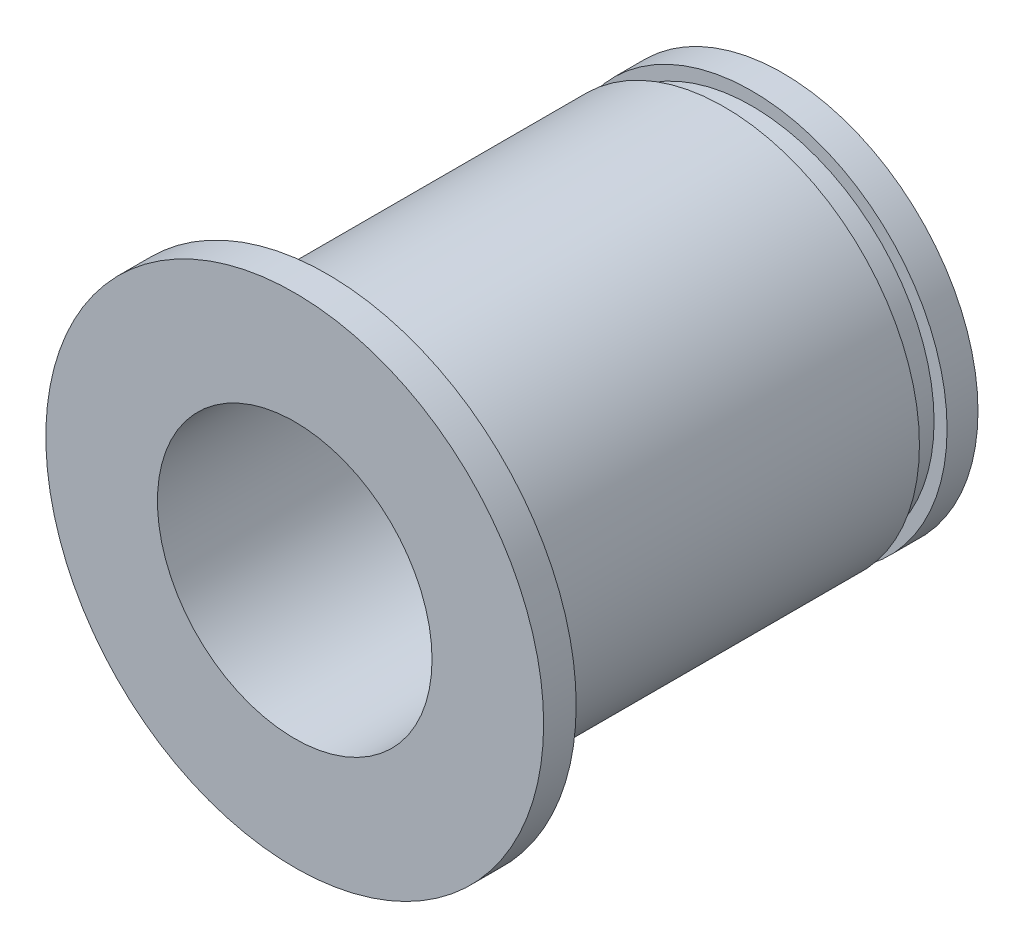
ISO-10303-21;
HEADER;
FILE_DESCRIPTION(('STEP AP214'),'2;1');
FILE_NAME('part.step','',(''),(''),'','','');
FILE_SCHEMA(('AUTOMOTIVE_DESIGN { 1 0 10303 214 1 1 1 1 }'));
ENDSEC;
DATA;
#1=APPLICATION_CONTEXT('core data for automotive mechanical design processes');
#2=APPLICATION_PROTOCOL_DEFINITION('international standard','automotive_design',2000,#1);
#3=PRODUCT_CONTEXT('',#1,'mechanical');
#4=PRODUCT('Part','Part','',(#3));
#5=PRODUCT_RELATED_PRODUCT_CATEGORY('part','',(#4));
#6=PRODUCT_DEFINITION_FORMATION('','',#4);
#7=PRODUCT_DEFINITION_CONTEXT('part definition',#1,'design');
#8=PRODUCT_DEFINITION('design','',#6,#7);
#9=PRODUCT_DEFINITION_SHAPE('','',#8);
#10=(LENGTH_UNIT() NAMED_UNIT(*) SI_UNIT(.MILLI.,.METRE.));
#11=(NAMED_UNIT(*) PLANE_ANGLE_UNIT() SI_UNIT($,.RADIAN.));
#12=(NAMED_UNIT(*) SI_UNIT($,.STERADIAN.) SOLID_ANGLE_UNIT());
#13=UNCERTAINTY_MEASURE_WITH_UNIT(LENGTH_MEASURE(1.E-05),#10,'distance_accuracy_value','');
#14=(GEOMETRIC_REPRESENTATION_CONTEXT(3) GLOBAL_UNCERTAINTY_ASSIGNED_CONTEXT((#13)) GLOBAL_UNIT_ASSIGNED_CONTEXT((#10,
#11,#12)) REPRESENTATION_CONTEXT('',''));
#15=CARTESIAN_POINT('',(0.,0.,0.));
#16=DIRECTION('',(0.,0.,1.));
#17=DIRECTION('',(1.,0.,0.));
#18=AXIS2_PLACEMENT_3D('',#15,#16,#17);
#19=CARTESIAN_POINT('',(0.,0.,12.));
#20=DIRECTION('',(0.,0.,-1.));
#21=DIRECTION('',(-1.,0.,0.));
#22=AXIS2_PLACEMENT_3D('',#19,#20,#21);
#23=CYLINDRICAL_SURFACE('',#22,6.);
#24=CARTESIAN_POINT('',(0.,0.,-2.));
#25=DIRECTION('',(0.,0.,1.));
#26=DIRECTION('',(1.,0.,0.));
#27=AXIS2_PLACEMENT_3D('',#24,#25,#26);
#28=CIRCLE('',#27,6.);
#29=CARTESIAN_POINT('',(6.,0.,-2.));
#30=VERTEX_POINT('',#29);
#31=EDGE_CURVE('E44',#30,#30,#28,.T.);
#32=ORIENTED_EDGE('',*,*,#31,.T.);
#33=EDGE_LOOP('',(#32));
#34=FACE_BOUND('',#33,.T.);
#35=CARTESIAN_POINT('',(0.,0.,-1.05));
#36=DIRECTION('',(0.,0.,1.));
#37=DIRECTION('',(1.,0.,0.));
#38=AXIS2_PLACEMENT_3D('',#35,#36,#37);
#39=CIRCLE('',#38,6.);
#40=CARTESIAN_POINT('',(6.,0.,-1.05));
#41=VERTEX_POINT('',#40);
#42=EDGE_CURVE('E53',#41,#41,#39,.T.);
#43=ORIENTED_EDGE('',*,*,#42,.F.);
#44=EDGE_LOOP('',(#43));
#45=FACE_BOUND('',#44,.T.);
#46=ADVANCED_FACE('F40',(#34,#45),#23,.T.);
#47=CARTESIAN_POINT('',(0.,0.,-2.));
#48=DIRECTION('',(0.,0.,1.));
#49=DIRECTION('',(1.,0.,0.));
#50=AXIS2_PLACEMENT_3D('',#47,#48,#49);
#51=PLANE('',#50);
#52=ORIENTED_EDGE('',*,*,#31,.F.);
#53=EDGE_LOOP('',(#52));
#54=FACE_BOUND('',#53,.T.);
#55=CARTESIAN_POINT('',(0.,0.,-2.));
#56=DIRECTION('',(0.,0.,1.));
#57=DIRECTION('',(1.,0.,0.));
#58=AXIS2_PLACEMENT_3D('',#55,#56,#57);
#59=CIRCLE('',#58,4.22);
#60=CARTESIAN_POINT('',(4.22,0.,-2.));
#61=VERTEX_POINT('',#60);
#62=EDGE_CURVE('E49',#61,#61,#59,.T.);
#63=ORIENTED_EDGE('',*,*,#62,.T.);
#64=EDGE_LOOP('',(#63));
#65=FACE_BOUND('',#64,.T.);
#66=ADVANCED_FACE('F94',(#54,#65),#51,.F.);
#67=CARTESIAN_POINT('',(0.,0.,-0.200000000000001));
#68=DIRECTION('',(0.,0.,1.));
#69=DIRECTION('',(1.,0.,0.));
#70=AXIS2_PLACEMENT_3D('',#67,#68,#69);
#71=CIRCLE('',#70,6.);
#72=CARTESIAN_POINT('',(6.,0.,-0.200000000000001));
#73=VERTEX_POINT('',#72);
#74=EDGE_CURVE('E41',#73,#73,#71,.T.);
#75=ORIENTED_EDGE('',*,*,#74,.T.);
#76=EDGE_LOOP('',(#75));
#77=FACE_BOUND('',#76,.T.);
#78=CARTESIAN_POINT('',(0.,0.,12.));
#79=DIRECTION('',(0.,0.,1.));
#80=DIRECTION('',(1.,0.,0.));
#81=AXIS2_PLACEMENT_3D('',#78,#79,#80);
#82=CIRCLE('',#81,6.);
#83=CARTESIAN_POINT('',(6.,0.,12.));
#84=VERTEX_POINT('',#83);
#85=EDGE_CURVE('E10',#84,#84,#82,.T.);
#86=ORIENTED_EDGE('',*,*,#85,.F.);
#87=EDGE_LOOP('',(#86));
#88=FACE_BOUND('',#87,.T.);
#89=ADVANCED_FACE('F39',(#77,#88),#23,.T.);
#90=CARTESIAN_POINT('',(0.,0.,12.));
#91=DIRECTION('',(0.,0.,-1.));
#92=DIRECTION('',(-1.,0.,0.));
#93=AXIS2_PLACEMENT_3D('',#90,#91,#92);
#94=CYLINDRICAL_SURFACE('',#93,4.22);
#95=ORIENTED_EDGE('',*,*,#62,.F.);
#96=EDGE_LOOP('',(#95));
#97=FACE_BOUND('',#96,.T.);
#98=CARTESIAN_POINT('',(0.,0.,13.));
#99=DIRECTION('',(0.,0.,1.));
#100=DIRECTION('',(1.,0.,0.));
#101=AXIS2_PLACEMENT_3D('',#98,#99,#100);
#102=CIRCLE('',#101,4.22);
#103=CARTESIAN_POINT('',(4.22,0.,13.));
#104=VERTEX_POINT('',#103);
#105=EDGE_CURVE('E58',#104,#104,#102,.T.);
#106=ORIENTED_EDGE('',*,*,#105,.T.);
#107=EDGE_LOOP('',(#106));
#108=FACE_BOUND('',#107,.T.);
#109=ADVANCED_FACE('F89',(#97,#108),#94,.F.);
#110=CARTESIAN_POINT('',(0.,0.,13.));
#111=DIRECTION('',(0.,0.,1.));
#112=DIRECTION('',(1.,0.,0.));
#113=AXIS2_PLACEMENT_3D('',#110,#111,#112);
#114=PLANE('',#113);
#115=CARTESIAN_POINT('',(0.,0.,13.));
#116=DIRECTION('',(0.,0.,1.));
#117=DIRECTION('',(1.,0.,0.));
#118=AXIS2_PLACEMENT_3D('',#115,#116,#117);
#119=CIRCLE('',#118,7.65);
#120=CARTESIAN_POINT('',(7.65,0.,13.));
#121=VERTEX_POINT('',#120);
#122=EDGE_CURVE('E75',#121,#121,#119,.T.);
#123=ORIENTED_EDGE('',*,*,#122,.T.);
#124=EDGE_LOOP('',(#123));
#125=FACE_BOUND('',#124,.T.);
#126=ORIENTED_EDGE('',*,*,#105,.F.);
#127=EDGE_LOOP('',(#126));
#128=FACE_BOUND('',#127,.T.);
#129=ADVANCED_FACE('F81',(#125,#128),#114,.T.);
#130=CARTESIAN_POINT('',(0.,0.,12.));
#131=DIRECTION('',(0.,0.,1.));
#132=DIRECTION('',(1.,0.,0.));
#133=AXIS2_PLACEMENT_3D('',#130,#131,#132);
#134=PLANE('',#133);
#135=ORIENTED_EDGE('',*,*,#85,.T.);
#136=EDGE_LOOP('',(#135));
#137=FACE_BOUND('',#136,.T.);
#138=CARTESIAN_POINT('',(0.,0.,12.));
#139=DIRECTION('',(0.,0.,1.));
#140=DIRECTION('',(1.,0.,0.));
#141=AXIS2_PLACEMENT_3D('',#138,#139,#140);
#142=CIRCLE('',#141,7.65);
#143=CARTESIAN_POINT('',(7.65,0.,12.));
#144=VERTEX_POINT('',#143);
#145=EDGE_CURVE('E72',#144,#144,#142,.T.);
#146=ORIENTED_EDGE('',*,*,#145,.F.);
#147=EDGE_LOOP('',(#146));
#148=FACE_BOUND('',#147,.T.);
#149=ADVANCED_FACE('F80',(#137,#148),#134,.F.);
#150=CARTESIAN_POINT('',(0.,0.,13.));
#151=DIRECTION('',(0.,0.,-1.));
#152=DIRECTION('',(-1.,0.,0.));
#153=AXIS2_PLACEMENT_3D('',#150,#151,#152);
#154=CYLINDRICAL_SURFACE('',#153,7.65);
#155=ORIENTED_EDGE('',*,*,#122,.F.);
#156=EDGE_LOOP('',(#155));
#157=FACE_BOUND('',#156,.T.);
#158=ORIENTED_EDGE('',*,*,#145,.T.);
#159=EDGE_LOOP('',(#158));
#160=FACE_BOUND('',#159,.T.);
#161=ADVANCED_FACE('F79',(#157,#160),#154,.T.);
#162=CARTESIAN_POINT('',(0.,0.,-0.2));
#163=DIRECTION('',(0.,0.,1.));
#164=DIRECTION('',(1.,0.,0.));
#165=AXIS2_PLACEMENT_3D('',#162,#163,#164);
#166=PLANE('',#165);
#167=CARTESIAN_POINT('',(0.,0.,-0.2));
#168=DIRECTION('',(0.,0.,1.));
#169=DIRECTION('',(1.,0.,0.));
#170=AXIS2_PLACEMENT_3D('',#167,#168,#169);
#171=CIRCLE('',#170,5.6);
#172=CARTESIAN_POINT('',(5.6,0.,-0.2));
#173=VERTEX_POINT('',#172);
#174=EDGE_CURVE('E57',#173,#173,#171,.T.);
#175=ORIENTED_EDGE('',*,*,#174,.T.);
#176=EDGE_LOOP('',(#175));
#177=FACE_BOUND('',#176,.T.);
#178=ORIENTED_EDGE('',*,*,#74,.F.);
#179=EDGE_LOOP('',(#178));
#180=FACE_BOUND('',#179,.T.);
#181=ADVANCED_FACE('F87',(#177,#180),#166,.F.);
#182=CARTESIAN_POINT('',(0.,0.,-1.05));
#183=DIRECTION('',(0.,0.,1.));
#184=DIRECTION('',(1.,0.,0.));
#185=AXIS2_PLACEMENT_3D('',#182,#183,#184);
#186=PLANE('',#185);
#187=CARTESIAN_POINT('',(0.,0.,-1.05));
#188=DIRECTION('',(0.,0.,1.));
#189=DIRECTION('',(1.,0.,0.));
#190=AXIS2_PLACEMENT_3D('',#187,#188,#189);
#191=CIRCLE('',#190,5.6);
#192=CARTESIAN_POINT('',(5.6,0.,-1.05));
#193=VERTEX_POINT('',#192);
#194=EDGE_CURVE('E64',#193,#193,#191,.T.);
#195=ORIENTED_EDGE('',*,*,#194,.F.);
#196=EDGE_LOOP('',(#195));
#197=FACE_BOUND('',#196,.T.);
#198=ORIENTED_EDGE('',*,*,#42,.T.);
#199=EDGE_LOOP('',(#198));
#200=FACE_BOUND('',#199,.T.);
#201=ADVANCED_FACE('F115',(#197,#200),#186,.T.);
#202=CARTESIAN_POINT('',(0.,0.,-0.2));
#203=DIRECTION('',(0.,0.,-1.));
#204=DIRECTION('',(-1.,0.,0.));
#205=AXIS2_PLACEMENT_3D('',#202,#203,#204);
#206=CYLINDRICAL_SURFACE('',#205,5.6);
#207=ORIENTED_EDGE('',*,*,#174,.F.);
#208=EDGE_LOOP('',(#207));
#209=FACE_BOUND('',#208,.T.);
#210=ORIENTED_EDGE('',*,*,#194,.T.);
#211=EDGE_LOOP('',(#210));
#212=FACE_BOUND('',#211,.T.);
#213=ADVANCED_FACE('F119',(#209,#212),#206,.T.);
#214=CLOSED_SHELL('',(#46,#66,#89,#109,#129,#149,#161,#181,#201,#213));
#215=MANIFOLD_SOLID_BREP('B2',#214);
#216=ADVANCED_BREP_SHAPE_REPRESENTATION('',(#18,#215),#14);
#217=SHAPE_DEFINITION_REPRESENTATION(#9,#216);
ENDSEC;
END-ISO-10303-21;
